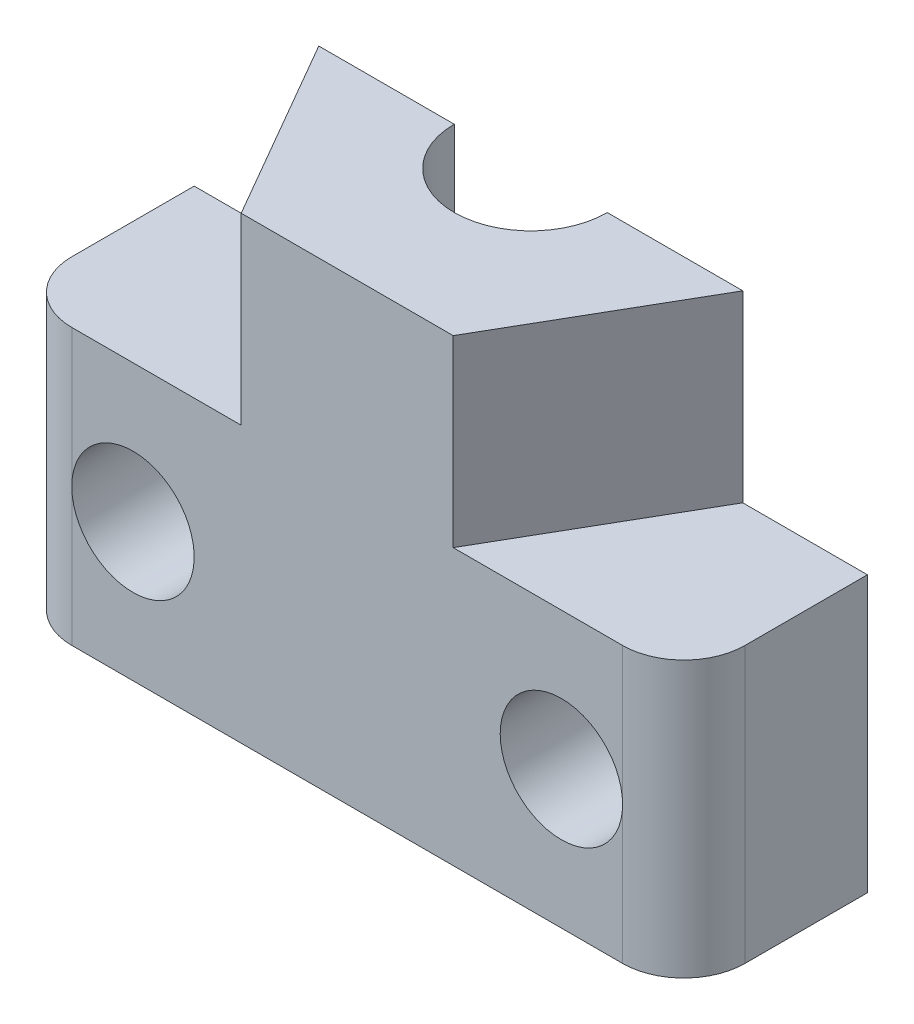
ISO-10303-21;
HEADER;
FILE_DESCRIPTION(('STEP AP214'),'2;1');
FILE_NAME('part.step','',(''),(''),'','','');
FILE_SCHEMA(('AUTOMOTIVE_DESIGN { 1 0 10303 214 1 1 1 1 }'));
ENDSEC;
DATA;
#1=APPLICATION_CONTEXT('core data for automotive mechanical design processes');
#2=APPLICATION_PROTOCOL_DEFINITION('international standard','automotive_design',2000,#1);
#3=PRODUCT_CONTEXT('',#1,'mechanical');
#4=PRODUCT('Part','Part','',(#3));
#5=PRODUCT_RELATED_PRODUCT_CATEGORY('part','',(#4));
#6=PRODUCT_DEFINITION_FORMATION('','',#4);
#7=PRODUCT_DEFINITION_CONTEXT('part definition',#1,'design');
#8=PRODUCT_DEFINITION('design','',#6,#7);
#9=PRODUCT_DEFINITION_SHAPE('','',#8);
#10=(LENGTH_UNIT() NAMED_UNIT(*) SI_UNIT(.MILLI.,.METRE.));
#11=(NAMED_UNIT(*) PLANE_ANGLE_UNIT() SI_UNIT($,.RADIAN.));
#12=(NAMED_UNIT(*) SI_UNIT($,.STERADIAN.) SOLID_ANGLE_UNIT());
#13=UNCERTAINTY_MEASURE_WITH_UNIT(LENGTH_MEASURE(1.E-05),#10,'distance_accuracy_value','');
#14=(GEOMETRIC_REPRESENTATION_CONTEXT(3) GLOBAL_UNCERTAINTY_ASSIGNED_CONTEXT((#13)) GLOBAL_UNIT_ASSIGNED_CONTEXT((#10,
#11,#12)) REPRESENTATION_CONTEXT('',''));
#15=CARTESIAN_POINT('',(0.,0.,0.));
#16=DIRECTION('',(0.,0.,1.));
#17=DIRECTION('',(1.,0.,0.));
#18=AXIS2_PLACEMENT_3D('',#15,#16,#17);
#19=CARTESIAN_POINT('',(0.,15.,0.));
#20=DIRECTION('',(0.,1.,0.));
#21=DIRECTION('',(0.,0.,1.));
#22=AXIS2_PLACEMENT_3D('',#19,#20,#21);
#23=PLANE('',#22);
#24=DIRECTION('',(0.5,0.,-0.866025403784439));
#25=VECTOR('',#24,1.);
#26=CARTESIAN_POINT('',(3.46410161513776,15.,6.00000000000001));
#27=LINE('',#26,#25);
#28=CARTESIAN_POINT('',(3.46410161513776,15.,6.00000000000001));
#29=VERTEX_POINT('',#28);
#30=CARTESIAN_POINT('',(6.92820323027551,15.,0.));
#31=VERTEX_POINT('',#30);
#32=EDGE_CURVE('E228',#29,#31,#27,.T.);
#33=ORIENTED_EDGE('',*,*,#32,.T.);
#34=DIRECTION('',(-1.,0.,0.));
#35=VECTOR('',#34,1.);
#36=CARTESIAN_POINT('',(0.,15.,0.));
#37=LINE('',#36,#35);
#38=CARTESIAN_POINT('',(2.5,15.,0.));
#39=VERTEX_POINT('',#38);
#40=EDGE_CURVE('E334',#31,#39,#37,.T.);
#41=ORIENTED_EDGE('',*,*,#40,.T.);
#42=CARTESIAN_POINT('',(0.,15.,0.));
#43=DIRECTION('',(0.,1.,0.));
#44=DIRECTION('',(0.,0.,1.));
#45=AXIS2_PLACEMENT_3D('',#42,#43,#44);
#46=CIRCLE('',#45,2.5);
#47=CARTESIAN_POINT('',(-2.5,15.,0.));
#48=VERTEX_POINT('',#47);
#49=EDGE_CURVE('E210',#48,#39,#46,.T.);
#50=ORIENTED_EDGE('',*,*,#49,.F.);
#51=CARTESIAN_POINT('',(-6.92820323027552,15.,0.));
#52=VERTEX_POINT('',#51);
#53=EDGE_CURVE('E62',#48,#52,#37,.T.);
#54=ORIENTED_EDGE('',*,*,#53,.T.);
#55=DIRECTION('',(0.5,0.,0.866025403784439));
#56=VECTOR('',#55,1.);
#57=CARTESIAN_POINT('',(-6.92820323027552,15.,0.));
#58=LINE('',#57,#56);
#59=CARTESIAN_POINT('',(-3.46410161513776,15.,6.00000000000001));
#60=VERTEX_POINT('',#59);
#61=EDGE_CURVE('E386',#52,#60,#58,.T.);
#62=ORIENTED_EDGE('',*,*,#61,.T.);
#63=DIRECTION('',(1.,0.,0.));
#64=VECTOR('',#63,1.);
#65=CARTESIAN_POINT('',(-3.46410161513776,15.,6.00000000000001));
#66=LINE('',#65,#64);
#67=EDGE_CURVE('E235',#60,#29,#66,.T.);
#68=ORIENTED_EDGE('',*,*,#67,.T.);
#69=EDGE_LOOP('',(#33,#41,#50,#54,#62,#68));
#70=FACE_BOUND('',#69,.T.);
#71=ADVANCED_FACE('F37',(#70),#23,.T.);
#72=CARTESIAN_POINT('',(0.,12.,0.));
#73=DIRECTION('',(0.,1.,0.));
#74=DIRECTION('',(0.,0.,1.));
#75=AXIS2_PLACEMENT_3D('',#72,#73,#74);
#76=PLANE('',#75);
#77=DIRECTION('',(-1.,0.,0.));
#78=VECTOR('',#77,1.);
#79=CARTESIAN_POINT('',(0.,12.,0.));
#80=LINE('',#79,#78);
#81=CARTESIAN_POINT('',(5.77350269189626,12.,0.));
#82=VERTEX_POINT('',#81);
#83=CARTESIAN_POINT('',(2.5,12.,0.));
#84=VERTEX_POINT('',#83);
#85=EDGE_CURVE('E54',#82,#84,#80,.T.);
#86=ORIENTED_EDGE('',*,*,#85,.F.);
#87=DIRECTION('',(0.5,0.,-0.866025403784439));
#88=VECTOR('',#87,1.);
#89=CARTESIAN_POINT('',(2.88675134594813,12.,5.));
#90=LINE('',#89,#88);
#91=CARTESIAN_POINT('',(2.88675134594813,12.,5.));
#92=VERTEX_POINT('',#91);
#93=EDGE_CURVE('E359',#92,#82,#90,.T.);
#94=ORIENTED_EDGE('',*,*,#93,.F.);
#95=DIRECTION('',(1.,0.,0.));
#96=VECTOR('',#95,1.);
#97=CARTESIAN_POINT('',(-2.88675134594813,12.,5.));
#98=LINE('',#97,#96);
#99=CARTESIAN_POINT('',(-2.88675134594813,12.,5.));
#100=VERTEX_POINT('',#99);
#101=EDGE_CURVE('E364',#100,#92,#98,.T.);
#102=ORIENTED_EDGE('',*,*,#101,.F.);
#103=DIRECTION('',(0.5,0.,0.866025403784438));
#104=VECTOR('',#103,1.);
#105=CARTESIAN_POINT('',(-5.77350269189626,12.,0.));
#106=LINE('',#105,#104);
#107=CARTESIAN_POINT('',(-5.77350269189626,12.,0.));
#108=VERTEX_POINT('',#107);
#109=EDGE_CURVE('E205',#108,#100,#106,.T.);
#110=ORIENTED_EDGE('',*,*,#109,.F.);
#111=CARTESIAN_POINT('',(-2.5,12.,0.));
#112=VERTEX_POINT('',#111);
#113=EDGE_CURVE('E191',#112,#108,#80,.T.);
#114=ORIENTED_EDGE('',*,*,#113,.F.);
#115=CARTESIAN_POINT('',(0.,12.,0.));
#116=DIRECTION('',(0.,1.,0.));
#117=DIRECTION('',(0.,0.,1.));
#118=AXIS2_PLACEMENT_3D('',#115,#116,#117);
#119=CIRCLE('',#118,2.5);
#120=EDGE_CURVE('E203',#84,#112,#119,.F.);
#121=ORIENTED_EDGE('',*,*,#120,.F.);
#122=EDGE_LOOP('',(#86,#94,#102,#110,#114,#121));
#123=FACE_BOUND('',#122,.T.);
#124=ADVANCED_FACE('F202',(#123),#76,.F.);
#125=CARTESIAN_POINT('',(0.,9.,0.));
#126=DIRECTION('',(0.,-1.,0.));
#127=DIRECTION('',(0.,0.,-1.));
#128=AXIS2_PLACEMENT_3D('',#125,#126,#127);
#129=PLANE('',#128);
#130=DIRECTION('',(1.,0.,0.));
#131=VECTOR('',#130,1.);
#132=CARTESIAN_POINT('',(0.,9.,0.));
#133=LINE('',#132,#131);
#134=CARTESIAN_POINT('',(-11.,9.,0.));
#135=VERTEX_POINT('',#134);
#136=CARTESIAN_POINT('',(-6.92820323027552,9.,0.));
#137=VERTEX_POINT('',#136);
#138=EDGE_CURVE('E322',#135,#137,#133,.T.);
#139=ORIENTED_EDGE('',*,*,#138,.F.);
#140=DIRECTION('',(0.,0.,1.));
#141=VECTOR('',#140,1.);
#142=CARTESIAN_POINT('',(-11.,9.,6.));
#143=LINE('',#142,#141);
#144=CARTESIAN_POINT('',(-11.,9.,4.));
#145=VERTEX_POINT('',#144);
#146=EDGE_CURVE('E258',#135,#145,#143,.T.);
#147=ORIENTED_EDGE('',*,*,#146,.T.);
#148=CARTESIAN_POINT('',(-9.,9.,4.));
#149=DIRECTION('',(0.,-1.,0.));
#150=DIRECTION('',(0.,0.,-1.));
#151=AXIS2_PLACEMENT_3D('',#148,#149,#150);
#152=CIRCLE('',#151,2.);
#153=CARTESIAN_POINT('',(-9.,9.,6.));
#154=VERTEX_POINT('',#153);
#155=EDGE_CURVE('E281',#145,#154,#152,.F.);
#156=ORIENTED_EDGE('',*,*,#155,.T.);
#157=DIRECTION('',(1.,0.,0.));
#158=VECTOR('',#157,1.);
#159=CARTESIAN_POINT('',(-11.,9.,6.));
#160=LINE('',#159,#158);
#161=CARTESIAN_POINT('',(-3.46410161513776,9.,6.));
#162=VERTEX_POINT('',#161);
#163=EDGE_CURVE('E269',#154,#162,#160,.T.);
#164=ORIENTED_EDGE('',*,*,#163,.T.);
#165=DIRECTION('',(0.5,0.,0.866025403784439));
#166=VECTOR('',#165,1.);
#167=CARTESIAN_POINT('',(-6.92820323027552,9.,0.));
#168=LINE('',#167,#166);
#169=EDGE_CURVE('E224',#137,#162,#168,.T.);
#170=ORIENTED_EDGE('',*,*,#169,.F.);
#171=EDGE_LOOP('',(#139,#147,#156,#164,#170));
#172=FACE_BOUND('',#171,.T.);
#173=ADVANCED_FACE('F419',(#172),#129,.F.);
#174=DIRECTION('',(1.,0.,0.));
#175=VECTOR('',#174,1.);
#176=CARTESIAN_POINT('',(0.,9.,0.));
#177=LINE('',#176,#175);
#178=CARTESIAN_POINT('',(6.92820323027551,9.,0.));
#179=VERTEX_POINT('',#178);
#180=CARTESIAN_POINT('',(11.,9.,0.));
#181=VERTEX_POINT('',#180);
#182=EDGE_CURVE('E314',#179,#181,#177,.T.);
#183=ORIENTED_EDGE('',*,*,#182,.F.);
#184=DIRECTION('',(0.5,0.,-0.866025403784439));
#185=VECTOR('',#184,1.);
#186=CARTESIAN_POINT('',(3.46410161513776,9.,6.00000000000001));
#187=LINE('',#186,#185);
#188=CARTESIAN_POINT('',(3.46410161513776,9.,6.));
#189=VERTEX_POINT('',#188);
#190=EDGE_CURVE('E229',#189,#179,#187,.T.);
#191=ORIENTED_EDGE('',*,*,#190,.F.);
#192=CARTESIAN_POINT('',(9.,9.,6.));
#193=VERTEX_POINT('',#192);
#194=EDGE_CURVE('E261',#189,#193,#160,.T.);
#195=ORIENTED_EDGE('',*,*,#194,.T.);
#196=CARTESIAN_POINT('',(9.,9.,4.));
#197=DIRECTION('',(0.,-1.,0.));
#198=DIRECTION('',(0.,0.,-1.));
#199=AXIS2_PLACEMENT_3D('',#196,#197,#198);
#200=CIRCLE('',#199,2.);
#201=CARTESIAN_POINT('',(11.,9.,4.));
#202=VERTEX_POINT('',#201);
#203=EDGE_CURVE('E279',#193,#202,#200,.F.);
#204=ORIENTED_EDGE('',*,*,#203,.T.);
#205=DIRECTION('',(0.,0.,-1.));
#206=VECTOR('',#205,1.);
#207=CARTESIAN_POINT('',(11.,9.,6.));
#208=LINE('',#207,#206);
#209=EDGE_CURVE('E255',#202,#181,#208,.T.);
#210=ORIENTED_EDGE('',*,*,#209,.T.);
#211=EDGE_LOOP('',(#183,#191,#195,#204,#210));
#212=FACE_BOUND('',#211,.T.);
#213=ADVANCED_FACE('F400',(#212),#129,.F.);
#214=CARTESIAN_POINT('',(0.,0.,0.));
#215=DIRECTION('',(0.,-1.,0.));
#216=DIRECTION('',(0.,0.,-1.));
#217=AXIS2_PLACEMENT_3D('',#214,#215,#216);
#218=PLANE('',#217);
#219=DIRECTION('',(0.,0.,1.));
#220=VECTOR('',#219,1.);
#221=CARTESIAN_POINT('',(-11.,0.,6.));
#222=LINE('',#221,#220);
#223=CARTESIAN_POINT('',(-11.,0.,0.));
#224=VERTEX_POINT('',#223);
#225=CARTESIAN_POINT('',(-11.,0.,4.));
#226=VERTEX_POINT('',#225);
#227=EDGE_CURVE('E291',#224,#226,#222,.T.);
#228=ORIENTED_EDGE('',*,*,#227,.F.);
#229=DIRECTION('',(1.,0.,0.));
#230=VECTOR('',#229,1.);
#231=CARTESIAN_POINT('',(0.,0.,0.));
#232=LINE('',#231,#230);
#233=CARTESIAN_POINT('',(-4.,0.,0.));
#234=VERTEX_POINT('',#233);
#235=EDGE_CURVE('E313',#224,#234,#232,.T.);
#236=ORIENTED_EDGE('',*,*,#235,.T.);
#237=CARTESIAN_POINT('',(0.,0.,0.));
#238=DIRECTION('',(0.,1.,0.));
#239=DIRECTION('',(0.,0.,1.));
#240=AXIS2_PLACEMENT_3D('',#237,#238,#239);
#241=CIRCLE('',#240,4.);
#242=CARTESIAN_POINT('',(4.,0.,0.));
#243=VERTEX_POINT('',#242);
#244=EDGE_CURVE('E251',#234,#243,#241,.T.);
#245=ORIENTED_EDGE('',*,*,#244,.T.);
#246=CARTESIAN_POINT('',(11.,0.,0.));
#247=VERTEX_POINT('',#246);
#248=EDGE_CURVE('E307',#243,#247,#232,.T.);
#249=ORIENTED_EDGE('',*,*,#248,.T.);
#250=DIRECTION('',(0.,0.,-1.));
#251=VECTOR('',#250,1.);
#252=CARTESIAN_POINT('',(11.,0.,6.));
#253=LINE('',#252,#251);
#254=CARTESIAN_POINT('',(11.,0.,4.));
#255=VERTEX_POINT('',#254);
#256=EDGE_CURVE('E254',#255,#247,#253,.T.);
#257=ORIENTED_EDGE('',*,*,#256,.F.);
#258=CARTESIAN_POINT('',(9.,0.,4.));
#259=DIRECTION('',(0.,-1.,0.));
#260=DIRECTION('',(0.,0.,-1.));
#261=AXIS2_PLACEMENT_3D('',#258,#259,#260);
#262=CIRCLE('',#261,2.);
#263=CARTESIAN_POINT('',(9.,0.,6.));
#264=VERTEX_POINT('',#263);
#265=EDGE_CURVE('E283',#255,#264,#262,.T.);
#266=ORIENTED_EDGE('',*,*,#265,.T.);
#267=DIRECTION('',(1.,0.,0.));
#268=VECTOR('',#267,1.);
#269=CARTESIAN_POINT('',(-11.,0.,6.));
#270=LINE('',#269,#268);
#271=CARTESIAN_POINT('',(-9.,0.,6.));
#272=VERTEX_POINT('',#271);
#273=EDGE_CURVE('E259',#272,#264,#270,.T.);
#274=ORIENTED_EDGE('',*,*,#273,.F.);
#275=CARTESIAN_POINT('',(-9.,0.,4.));
#276=DIRECTION('',(0.,-1.,0.));
#277=DIRECTION('',(0.,0.,-1.));
#278=AXIS2_PLACEMENT_3D('',#275,#276,#277);
#279=CIRCLE('',#278,2.);
#280=EDGE_CURVE('E285',#272,#226,#279,.T.);
#281=ORIENTED_EDGE('',*,*,#280,.T.);
#282=EDGE_LOOP('',(#228,#236,#245,#249,#257,#266,#274,#281));
#283=FACE_BOUND('',#282,.T.);
#284=ADVANCED_FACE('F305',(#283),#218,.T.);
#285=CARTESIAN_POINT('',(11.,9.,6.));
#286=DIRECTION('',(-1.,0.,0.));
#287=DIRECTION('',(0.,0.,1.));
#288=AXIS2_PLACEMENT_3D('',#285,#286,#287);
#289=PLANE('',#288);
#290=DIRECTION('',(0.,-1.,0.));
#291=VECTOR('',#290,1.);
#292=CARTESIAN_POINT('',(11.,9.,0.));
#293=LINE('',#292,#291);
#294=EDGE_CURVE('E301',#181,#247,#293,.T.);
#295=ORIENTED_EDGE('',*,*,#294,.F.);
#296=ORIENTED_EDGE('',*,*,#209,.F.);
#297=DIRECTION('',(0.,-1.,0.));
#298=VECTOR('',#297,1.);
#299=CARTESIAN_POINT('',(11.,9.,4.));
#300=LINE('',#299,#298);
#301=EDGE_CURVE('E276',#202,#255,#300,.T.);
#302=ORIENTED_EDGE('',*,*,#301,.T.);
#303=ORIENTED_EDGE('',*,*,#256,.T.);
#304=EDGE_LOOP('',(#295,#296,#302,#303));
#305=FACE_BOUND('',#304,.T.);
#306=ADVANCED_FACE('F299',(#305),#289,.F.);
#307=CARTESIAN_POINT('',(-11.,9.,6.));
#308=DIRECTION('',(1.,0.,0.));
#309=DIRECTION('',(0.,0.,-1.));
#310=AXIS2_PLACEMENT_3D('',#307,#308,#309);
#311=PLANE('',#310);
#312=DIRECTION('',(0.,1.,0.));
#313=VECTOR('',#312,1.);
#314=CARTESIAN_POINT('',(-11.,9.,0.));
#315=LINE('',#314,#313);
#316=EDGE_CURVE('E320',#224,#135,#315,.T.);
#317=ORIENTED_EDGE('',*,*,#316,.F.);
#318=ORIENTED_EDGE('',*,*,#227,.T.);
#319=DIRECTION('',(0.,-1.,0.));
#320=VECTOR('',#319,1.);
#321=CARTESIAN_POINT('',(-11.,9.,4.));
#322=LINE('',#321,#320);
#323=EDGE_CURVE('E270',#226,#145,#322,.F.);
#324=ORIENTED_EDGE('',*,*,#323,.T.);
#325=ORIENTED_EDGE('',*,*,#146,.F.);
#326=EDGE_LOOP('',(#317,#318,#324,#325));
#327=FACE_BOUND('',#326,.T.);
#328=ADVANCED_FACE('F416',(#327),#311,.F.);
#329=CARTESIAN_POINT('',(0.,8.,0.));
#330=DIRECTION('',(0.,-1.,0.));
#331=DIRECTION('',(0.,0.,-1.));
#332=AXIS2_PLACEMENT_3D('',#329,#330,#331);
#333=CYLINDRICAL_SURFACE('',#332,4.);
#334=CARTESIAN_POINT('',(0.,8.,0.));
#335=DIRECTION('',(0.,-1.,0.));
#336=DIRECTION('',(0.,0.,-1.));
#337=AXIS2_PLACEMENT_3D('',#334,#335,#336);
#338=CIRCLE('',#337,4.);
#339=CARTESIAN_POINT('',(4.,8.,0.));
#340=VERTEX_POINT('',#339);
#341=CARTESIAN_POINT('',(-4.,8.,0.));
#342=VERTEX_POINT('',#341);
#343=EDGE_CURVE('E244',#340,#342,#338,.T.);
#344=ORIENTED_EDGE('',*,*,#343,.F.);
#345=DIRECTION('',(0.,-1.,0.));
#346=VECTOR('',#345,1.);
#347=CARTESIAN_POINT('',(4.,8.,0.));
#348=LINE('',#347,#346);
#349=EDGE_CURVE('E311',#340,#243,#348,.T.);
#350=ORIENTED_EDGE('',*,*,#349,.T.);
#351=ORIENTED_EDGE('',*,*,#244,.F.);
#352=DIRECTION('',(0.,-1.,0.));
#353=VECTOR('',#352,1.);
#354=CARTESIAN_POINT('',(-4.,8.,0.));
#355=LINE('',#354,#353);
#356=EDGE_CURVE('E321',#234,#342,#355,.F.);
#357=ORIENTED_EDGE('',*,*,#356,.T.);
#358=EDGE_LOOP('',(#344,#350,#351,#357));
#359=FACE_BOUND('',#358,.T.);
#360=ADVANCED_FACE('F491',(#359),#333,.F.);
#361=CARTESIAN_POINT('',(0.,9.,0.));
#362=DIRECTION('',(0.,-1.,0.));
#363=DIRECTION('',(0.,0.,-1.));
#364=AXIS2_PLACEMENT_3D('',#361,#362,#363);
#365=CYLINDRICAL_SURFACE('',#364,5.);
#366=DIRECTION('',(0.,-1.,0.));
#367=VECTOR('',#366,1.);
#368=CARTESIAN_POINT('',(5.,9.,0.));
#369=LINE('',#368,#367);
#370=CARTESIAN_POINT('',(5.,8.,0.));
#371=VERTEX_POINT('',#370);
#372=CARTESIAN_POINT('',(5.,9.,0.));
#373=VERTEX_POINT('',#372);
#374=EDGE_CURVE('E425',#371,#373,#369,.F.);
#375=ORIENTED_EDGE('',*,*,#374,.F.);
#376=CARTESIAN_POINT('',(0.,8.,0.));
#377=DIRECTION('',(0.,-1.,0.));
#378=DIRECTION('',(0.,0.,-1.));
#379=AXIS2_PLACEMENT_3D('',#376,#377,#378);
#380=CIRCLE('',#379,5.);
#381=CARTESIAN_POINT('',(-5.,8.,0.));
#382=VERTEX_POINT('',#381);
#383=EDGE_CURVE('E241',#371,#382,#380,.T.);
#384=ORIENTED_EDGE('',*,*,#383,.T.);
#385=DIRECTION('',(0.,-1.,0.));
#386=VECTOR('',#385,1.);
#387=CARTESIAN_POINT('',(-5.,9.,0.));
#388=LINE('',#387,#386);
#389=CARTESIAN_POINT('',(-5.,9.,0.));
#390=VERTEX_POINT('',#389);
#391=EDGE_CURVE('E327',#390,#382,#388,.T.);
#392=ORIENTED_EDGE('',*,*,#391,.F.);
#393=CARTESIAN_POINT('',(0.,9.,0.));
#394=DIRECTION('',(0.,-1.,0.));
#395=DIRECTION('',(0.,0.,-1.));
#396=AXIS2_PLACEMENT_3D('',#393,#394,#395);
#397=CIRCLE('',#396,5.);
#398=CARTESIAN_POINT('',(-4.3301270189222,9.,2.5));
#399=VERTEX_POINT('',#398);
#400=EDGE_CURVE('E246',#399,#390,#397,.T.);
#401=ORIENTED_EDGE('',*,*,#400,.F.);
#402=CARTESIAN_POINT('',(0.,9.,5.));
#403=VERTEX_POINT('',#402);
#404=EDGE_CURVE('E445',#403,#399,#397,.T.);
#405=ORIENTED_EDGE('',*,*,#404,.F.);
#406=CARTESIAN_POINT('',(4.3301270189222,9.,2.5));
#407=VERTEX_POINT('',#406);
#408=EDGE_CURVE('E245',#407,#403,#397,.T.);
#409=ORIENTED_EDGE('',*,*,#408,.F.);
#410=EDGE_CURVE('E242',#373,#407,#397,.T.);
#411=ORIENTED_EDGE('',*,*,#410,.F.);
#412=EDGE_LOOP('',(#375,#384,#392,#401,#405,#409,#411));
#413=FACE_BOUND('',#412,.T.);
#414=ADVANCED_FACE('F434',(#413),#365,.F.);
#415=CARTESIAN_POINT('',(0.,8.,0.));
#416=DIRECTION('',(0.,-1.,0.));
#417=DIRECTION('',(0.,0.,-1.));
#418=AXIS2_PLACEMENT_3D('',#415,#416,#417);
#419=PLANE('',#418);
#420=DIRECTION('',(1.,0.,0.));
#421=VECTOR('',#420,1.);
#422=CARTESIAN_POINT('',(0.,8.,0.));
#423=LINE('',#422,#421);
#424=EDGE_CURVE('E324',#382,#342,#423,.T.);
#425=ORIENTED_EDGE('',*,*,#424,.F.);
#426=ORIENTED_EDGE('',*,*,#383,.F.);
#427=EDGE_CURVE('E316',#340,#371,#423,.T.);
#428=ORIENTED_EDGE('',*,*,#427,.F.);
#429=ORIENTED_EDGE('',*,*,#343,.T.);
#430=EDGE_LOOP('',(#425,#426,#428,#429));
#431=FACE_BOUND('',#430,.T.);
#432=ADVANCED_FACE('F438',(#431),#419,.F.);
#433=CARTESIAN_POINT('',(0.,9.,0.));
#434=DIRECTION('',(0.,1.,0.));
#435=DIRECTION('',(0.,0.,1.));
#436=AXIS2_PLACEMENT_3D('',#433,#434,#435);
#437=PLANE('',#436);
#438=DIRECTION('',(0.5,0.,-0.866025403784439));
#439=VECTOR('',#438,1.);
#440=CARTESIAN_POINT('',(2.88675134594813,9.,5.));
#441=LINE('',#440,#439);
#442=CARTESIAN_POINT('',(5.77350269189626,9.,0.));
#443=VERTEX_POINT('',#442);
#444=EDGE_CURVE('E209',#407,#443,#441,.T.);
#445=ORIENTED_EDGE('',*,*,#444,.T.);
#446=DIRECTION('',(-1.,0.,0.));
#447=VECTOR('',#446,1.);
#448=CARTESIAN_POINT('',(0.,9.,0.));
#449=LINE('',#448,#447);
#450=EDGE_CURVE('E422',#443,#373,#449,.T.);
#451=ORIENTED_EDGE('',*,*,#450,.T.);
#452=ORIENTED_EDGE('',*,*,#410,.T.);
#453=EDGE_LOOP('',(#445,#451,#452));
#454=FACE_BOUND('',#453,.T.);
#455=ADVANCED_FACE('F464',(#454),#437,.T.);
#456=ORIENTED_EDGE('',*,*,#400,.T.);
#457=DIRECTION('',(-1.,0.,0.));
#458=VECTOR('',#457,1.);
#459=CARTESIAN_POINT('',(0.,9.,0.));
#460=LINE('',#459,#458);
#461=CARTESIAN_POINT('',(-5.77350269189626,9.,0.));
#462=VERTEX_POINT('',#461);
#463=EDGE_CURVE('E331',#390,#462,#460,.T.);
#464=ORIENTED_EDGE('',*,*,#463,.T.);
#465=DIRECTION('',(0.5,0.,0.866025403784438));
#466=VECTOR('',#465,1.);
#467=CARTESIAN_POINT('',(-5.77350269189626,9.,0.));
#468=LINE('',#467,#466);
#469=EDGE_CURVE('E369',#462,#399,#468,.T.);
#470=ORIENTED_EDGE('',*,*,#469,.T.);
#471=EDGE_LOOP('',(#456,#464,#470));
#472=FACE_BOUND('',#471,.T.);
#473=ADVANCED_FACE('F443',(#472),#437,.T.);
#474=CARTESIAN_POINT('',(0.,22.0710678118655,0.));
#475=DIRECTION('',(0.,-1.,0.));
#476=DIRECTION('',(0.,0.,-1.));
#477=AXIS2_PLACEMENT_3D('',#474,#475,#476);
#478=CYLINDRICAL_SURFACE('',#477,2.5);
#479=ORIENTED_EDGE('',*,*,#49,.T.);
#480=DIRECTION('',(0.,-1.,0.));
#481=VECTOR('',#480,1.);
#482=CARTESIAN_POINT('',(2.5,22.0710678118655,0.));
#483=LINE('',#482,#481);
#484=EDGE_CURVE('E208',#39,#84,#483,.T.);
#485=ORIENTED_EDGE('',*,*,#484,.T.);
#486=ORIENTED_EDGE('',*,*,#120,.T.);
#487=DIRECTION('',(0.,-1.,0.));
#488=VECTOR('',#487,1.);
#489=CARTESIAN_POINT('',(-2.5,22.0710678118655,0.));
#490=LINE('',#489,#488);
#491=EDGE_CURVE('E188',#112,#48,#490,.F.);
#492=ORIENTED_EDGE('',*,*,#491,.T.);
#493=EDGE_LOOP('',(#479,#485,#486,#492));
#494=FACE_BOUND('',#493,.T.);
#495=ADVANCED_FACE('F207',(#494),#478,.F.);
#496=CARTESIAN_POINT('',(-7.,4.5,6.00005));
#497=DIRECTION('',(0.,0.,-1.));
#498=DIRECTION('',(-1.,0.,0.));
#499=AXIS2_PLACEMENT_3D('',#496,#497,#498);
#500=CYLINDRICAL_SURFACE('',#499,2.);
#501=CARTESIAN_POINT('',(-7.,4.5,6.));
#502=DIRECTION('',(0.,0.,-1.));
#503=DIRECTION('',(-1.,0.,0.));
#504=AXIS2_PLACEMENT_3D('',#501,#502,#503);
#505=CIRCLE('',#504,2.);
#506=CARTESIAN_POINT('',(-9.,4.5,6.));
#507=VERTEX_POINT('',#506);
#508=EDGE_CURVE('E214',#507,#507,#505,.T.);
#509=ORIENTED_EDGE('',*,*,#508,.F.);
#510=EDGE_LOOP('',(#509));
#511=FACE_BOUND('',#510,.T.);
#512=CARTESIAN_POINT('',(-7.,4.5,0.));
#513=DIRECTION('',(0.,0.,-1.));
#514=DIRECTION('',(-1.,0.,0.));
#515=AXIS2_PLACEMENT_3D('',#512,#513,#514);
#516=CIRCLE('',#515,2.);
#517=CARTESIAN_POINT('',(-9.,4.5,0.));
#518=VERTEX_POINT('',#517);
#519=EDGE_CURVE('E197',#518,#518,#516,.F.);
#520=ORIENTED_EDGE('',*,*,#519,.F.);
#521=EDGE_LOOP('',(#520));
#522=FACE_BOUND('',#521,.T.);
#523=ADVANCED_FACE('F623',(#511,#522),#500,.F.);
#524=CARTESIAN_POINT('',(7.,4.5,6.00005));
#525=DIRECTION('',(0.,0.,-1.));
#526=DIRECTION('',(-1.,0.,0.));
#527=AXIS2_PLACEMENT_3D('',#524,#525,#526);
#528=CYLINDRICAL_SURFACE('',#527,2.);
#529=CARTESIAN_POINT('',(7.,4.5,6.));
#530=DIRECTION('',(0.,0.,-1.));
#531=DIRECTION('',(-1.,0.,0.));
#532=AXIS2_PLACEMENT_3D('',#529,#530,#531);
#533=CIRCLE('',#532,2.);
#534=CARTESIAN_POINT('',(9.,4.5,6.));
#535=VERTEX_POINT('',#534);
#536=EDGE_CURVE('E353',#535,#535,#533,.F.);
#537=ORIENTED_EDGE('',*,*,#536,.T.);
#538=EDGE_LOOP('',(#537));
#539=FACE_BOUND('',#538,.T.);
#540=CARTESIAN_POINT('',(7.,4.5,0.));
#541=DIRECTION('',(0.,0.,-1.));
#542=DIRECTION('',(-1.,0.,0.));
#543=AXIS2_PLACEMENT_3D('',#540,#541,#542);
#544=CIRCLE('',#543,2.);
#545=CARTESIAN_POINT('',(5.,4.5,0.));
#546=VERTEX_POINT('',#545);
#547=EDGE_CURVE('E41',#546,#546,#544,.T.);
#548=ORIENTED_EDGE('',*,*,#547,.T.);
#549=EDGE_LOOP('',(#548));
#550=FACE_BOUND('',#549,.T.);
#551=ADVANCED_FACE('F343',(#539,#550),#528,.F.);
#552=CARTESIAN_POINT('',(-11.,9.,6.));
#553=DIRECTION('',(0.,0.,-1.));
#554=DIRECTION('',(-1.,0.,0.));
#555=AXIS2_PLACEMENT_3D('',#552,#553,#554);
#556=PLANE('',#555);
#557=DIRECTION('',(0.,-1.,0.));
#558=VECTOR('',#557,1.);
#559=CARTESIAN_POINT('',(9.,9.,6.));
#560=LINE('',#559,#558);
#561=EDGE_CURVE('E11',#264,#535,#560,.F.);
#562=ORIENTED_EDGE('',*,*,#561,.T.);
#563=ORIENTED_EDGE('',*,*,#536,.F.);
#564=EDGE_CURVE('E46',#535,#193,#560,.F.);
#565=ORIENTED_EDGE('',*,*,#564,.T.);
#566=ORIENTED_EDGE('',*,*,#194,.F.);
#567=DIRECTION('',(0.,-1.,0.));
#568=VECTOR('',#567,1.);
#569=CARTESIAN_POINT('',(3.46410161513776,15.,6.00000000000001));
#570=LINE('',#569,#568);
#571=EDGE_CURVE('E223',#29,#189,#570,.T.);
#572=ORIENTED_EDGE('',*,*,#571,.F.);
#573=ORIENTED_EDGE('',*,*,#67,.F.);
#574=DIRECTION('',(0.,-1.,0.));
#575=VECTOR('',#574,1.);
#576=CARTESIAN_POINT('',(-3.46410161513776,15.,6.00000000000001));
#577=LINE('',#576,#575);
#578=EDGE_CURVE('E219',#60,#162,#577,.T.);
#579=ORIENTED_EDGE('',*,*,#578,.T.);
#580=ORIENTED_EDGE('',*,*,#163,.F.);
#581=DIRECTION('',(0.,-1.,0.));
#582=VECTOR('',#581,1.);
#583=CARTESIAN_POINT('',(-9.,9.,6.));
#584=LINE('',#583,#582);
#585=EDGE_CURVE('E272',#154,#507,#584,.T.);
#586=ORIENTED_EDGE('',*,*,#585,.T.);
#587=ORIENTED_EDGE('',*,*,#508,.T.);
#588=EDGE_CURVE('E275',#507,#272,#584,.T.);
#589=ORIENTED_EDGE('',*,*,#588,.T.);
#590=ORIENTED_EDGE('',*,*,#273,.T.);
#591=EDGE_LOOP('',(#562,#563,#565,#566,#572,#573,#579,#580,#586,#587,#589,#590));
#592=FACE_BOUND('',#591,.T.);
#593=ADVANCED_FACE('F403',(#592),#556,.F.);
#594=CARTESIAN_POINT('',(9.,9.,4.));
#595=DIRECTION('',(0.,-1.,0.));
#596=DIRECTION('',(0.,0.,-1.));
#597=AXIS2_PLACEMENT_3D('',#594,#595,#596);
#598=CYLINDRICAL_SURFACE('',#597,2.);
#599=ORIENTED_EDGE('',*,*,#203,.F.);
#600=ORIENTED_EDGE('',*,*,#564,.F.);
#601=ORIENTED_EDGE('',*,*,#561,.F.);
#602=ORIENTED_EDGE('',*,*,#265,.F.);
#603=ORIENTED_EDGE('',*,*,#301,.F.);
#604=EDGE_LOOP('',(#599,#600,#601,#602,#603));
#605=FACE_BOUND('',#604,.T.);
#606=ADVANCED_FACE('F408',(#605),#598,.T.);
#607=CARTESIAN_POINT('',(-9.,9.,4.));
#608=DIRECTION('',(0.,-1.,0.));
#609=DIRECTION('',(0.,0.,-1.));
#610=AXIS2_PLACEMENT_3D('',#607,#608,#609);
#611=CYLINDRICAL_SURFACE('',#610,2.);
#612=ORIENTED_EDGE('',*,*,#155,.F.);
#613=ORIENTED_EDGE('',*,*,#323,.F.);
#614=ORIENTED_EDGE('',*,*,#280,.F.);
#615=ORIENTED_EDGE('',*,*,#588,.F.);
#616=ORIENTED_EDGE('',*,*,#585,.F.);
#617=EDGE_LOOP('',(#612,#613,#614,#615,#616));
#618=FACE_BOUND('',#617,.T.);
#619=ADVANCED_FACE('F39',(#618),#611,.T.);
#620=CARTESIAN_POINT('',(-6.92820323027552,15.,0.));
#621=DIRECTION('',(0.866025403784439,0.,-0.5));
#622=DIRECTION('',(-0.5,0.,-0.866025403784439));
#623=AXIS2_PLACEMENT_3D('',#620,#621,#622);
#624=PLANE('',#623);
#625=ORIENTED_EDGE('',*,*,#169,.T.);
#626=ORIENTED_EDGE('',*,*,#578,.F.);
#627=ORIENTED_EDGE('',*,*,#61,.F.);
#628=DIRECTION('',(0.,-1.,0.));
#629=VECTOR('',#628,1.);
#630=CARTESIAN_POINT('',(-6.92820323027552,15.,0.));
#631=LINE('',#630,#629);
#632=EDGE_CURVE('E222',#52,#137,#631,.T.);
#633=ORIENTED_EDGE('',*,*,#632,.T.);
#634=EDGE_LOOP('',(#625,#626,#627,#633));
#635=FACE_BOUND('',#634,.T.);
#636=ADVANCED_FACE('F483',(#635),#624,.F.);
#637=CARTESIAN_POINT('',(3.46410161513776,15.,6.00000000000001));
#638=DIRECTION('',(-0.866025403784439,0.,-0.5));
#639=DIRECTION('',(-0.5,0.,0.866025403784439));
#640=AXIS2_PLACEMENT_3D('',#637,#638,#639);
#641=PLANE('',#640);
#642=ORIENTED_EDGE('',*,*,#190,.T.);
#643=DIRECTION('',(0.,-1.,0.));
#644=VECTOR('',#643,1.);
#645=CARTESIAN_POINT('',(6.92820323027551,15.,0.));
#646=LINE('',#645,#644);
#647=EDGE_CURVE('E239',#31,#179,#646,.T.);
#648=ORIENTED_EDGE('',*,*,#647,.F.);
#649=ORIENTED_EDGE('',*,*,#32,.F.);
#650=ORIENTED_EDGE('',*,*,#571,.T.);
#651=EDGE_LOOP('',(#642,#648,#649,#650));
#652=FACE_BOUND('',#651,.T.);
#653=ADVANCED_FACE('F397',(#652),#641,.F.);
#654=ORIENTED_EDGE('',*,*,#408,.T.);
#655=DIRECTION('',(1.,0.,0.));
#656=VECTOR('',#655,1.);
#657=CARTESIAN_POINT('',(-2.88675134594813,9.,5.));
#658=LINE('',#657,#656);
#659=CARTESIAN_POINT('',(2.88675134594813,9.,5.));
#660=VERTEX_POINT('',#659);
#661=EDGE_CURVE('E372',#403,#660,#658,.T.);
#662=ORIENTED_EDGE('',*,*,#661,.T.);
#663=EDGE_CURVE('E212',#660,#407,#441,.T.);
#664=ORIENTED_EDGE('',*,*,#663,.T.);
#665=EDGE_LOOP('',(#654,#662,#664));
#666=FACE_BOUND('',#665,.T.);
#667=ADVANCED_FACE('F450',(#666),#437,.T.);
#668=ORIENTED_EDGE('',*,*,#404,.T.);
#669=CARTESIAN_POINT('',(-2.88675134594813,9.,5.));
#670=VERTEX_POINT('',#669);
#671=EDGE_CURVE('E368',#399,#670,#468,.T.);
#672=ORIENTED_EDGE('',*,*,#671,.T.);
#673=EDGE_CURVE('E362',#670,#403,#658,.T.);
#674=ORIENTED_EDGE('',*,*,#673,.T.);
#675=EDGE_LOOP('',(#668,#672,#674));
#676=FACE_BOUND('',#675,.T.);
#677=ADVANCED_FACE('F456',(#676),#437,.T.);
#678=CARTESIAN_POINT('',(2.88675134594813,12.,5.));
#679=DIRECTION('',(-0.866025403784439,0.,-0.5));
#680=DIRECTION('',(-0.5,0.,0.866025403784439));
#681=AXIS2_PLACEMENT_3D('',#678,#679,#680);
#682=PLANE('',#681);
#683=ORIENTED_EDGE('',*,*,#663,.F.);
#684=DIRECTION('',(0.,-1.,0.));
#685=VECTOR('',#684,1.);
#686=CARTESIAN_POINT('',(2.88675134594813,12.,5.));
#687=LINE('',#686,#685);
#688=EDGE_CURVE('E365',#92,#660,#687,.T.);
#689=ORIENTED_EDGE('',*,*,#688,.F.);
#690=ORIENTED_EDGE('',*,*,#93,.T.);
#691=DIRECTION('',(0.,-1.,0.));
#692=VECTOR('',#691,1.);
#693=CARTESIAN_POINT('',(5.77350269189626,12.,0.));
#694=LINE('',#693,#692);
#695=EDGE_CURVE('E382',#82,#443,#694,.T.);
#696=ORIENTED_EDGE('',*,*,#695,.T.);
#697=ORIENTED_EDGE('',*,*,#444,.F.);
#698=EDGE_LOOP('',(#683,#689,#690,#696,#697));
#699=FACE_BOUND('',#698,.T.);
#700=ADVANCED_FACE('F461',(#699),#682,.T.);
#701=CARTESIAN_POINT('',(-5.77350269189626,12.,0.));
#702=DIRECTION('',(0.866025403784439,0.,-0.5));
#703=DIRECTION('',(-0.5,0.,-0.866025403784439));
#704=AXIS2_PLACEMENT_3D('',#701,#702,#703);
#705=PLANE('',#704);
#706=ORIENTED_EDGE('',*,*,#469,.F.);
#707=DIRECTION('',(0.,-1.,0.));
#708=VECTOR('',#707,1.);
#709=CARTESIAN_POINT('',(-5.77350269189626,12.,0.));
#710=LINE('',#709,#708);
#711=EDGE_CURVE('E380',#108,#462,#710,.T.);
#712=ORIENTED_EDGE('',*,*,#711,.F.);
#713=ORIENTED_EDGE('',*,*,#109,.T.);
#714=DIRECTION('',(0.,-1.,0.));
#715=VECTOR('',#714,1.);
#716=CARTESIAN_POINT('',(-2.88675134594813,12.,5.));
#717=LINE('',#716,#715);
#718=EDGE_CURVE('E377',#100,#670,#717,.T.);
#719=ORIENTED_EDGE('',*,*,#718,.T.);
#720=ORIENTED_EDGE('',*,*,#671,.F.);
#721=EDGE_LOOP('',(#706,#712,#713,#719,#720));
#722=FACE_BOUND('',#721,.T.);
#723=ADVANCED_FACE('F458',(#722),#705,.T.);
#724=CARTESIAN_POINT('',(-2.88675134594813,12.,5.));
#725=DIRECTION('',(0.,0.,-1.));
#726=DIRECTION('',(-1.,0.,0.));
#727=AXIS2_PLACEMENT_3D('',#724,#725,#726);
#728=PLANE('',#727);
#729=ORIENTED_EDGE('',*,*,#673,.F.);
#730=ORIENTED_EDGE('',*,*,#718,.F.);
#731=ORIENTED_EDGE('',*,*,#101,.T.);
#732=ORIENTED_EDGE('',*,*,#688,.T.);
#733=ORIENTED_EDGE('',*,*,#661,.F.);
#734=EDGE_LOOP('',(#729,#730,#731,#732,#733));
#735=FACE_BOUND('',#734,.T.);
#736=ADVANCED_FACE('F347',(#735),#728,.T.);
#737=CARTESIAN_POINT('',(0.,0.,0.));
#738=DIRECTION('',(0.,0.,-1.));
#739=DIRECTION('',(-1.,0.,0.));
#740=AXIS2_PLACEMENT_3D('',#737,#738,#739);
#741=PLANE('',#740);
#742=ORIENTED_EDGE('',*,*,#547,.F.);
#743=EDGE_LOOP('',(#742));
#744=FACE_BOUND('',#743,.T.);
#745=ORIENTED_EDGE('',*,*,#182,.T.);
#746=ORIENTED_EDGE('',*,*,#294,.T.);
#747=ORIENTED_EDGE('',*,*,#248,.F.);
#748=ORIENTED_EDGE('',*,*,#349,.F.);
#749=ORIENTED_EDGE('',*,*,#427,.T.);
#750=ORIENTED_EDGE('',*,*,#374,.T.);
#751=ORIENTED_EDGE('',*,*,#450,.F.);
#752=ORIENTED_EDGE('',*,*,#695,.F.);
#753=ORIENTED_EDGE('',*,*,#85,.T.);
#754=ORIENTED_EDGE('',*,*,#484,.F.);
#755=ORIENTED_EDGE('',*,*,#40,.F.);
#756=ORIENTED_EDGE('',*,*,#647,.T.);
#757=EDGE_LOOP('',(#745,#746,#747,#748,#749,#750,#751,#752,#753,#754,#755,#756));
#758=FACE_BOUND('',#757,.T.);
#759=ADVANCED_FACE('F345',(#744,#758),#741,.T.);
#760=ORIENTED_EDGE('',*,*,#519,.T.);
#761=EDGE_LOOP('',(#760));
#762=FACE_BOUND('',#761,.T.);
#763=ORIENTED_EDGE('',*,*,#138,.T.);
#764=ORIENTED_EDGE('',*,*,#632,.F.);
#765=ORIENTED_EDGE('',*,*,#53,.F.);
#766=ORIENTED_EDGE('',*,*,#491,.F.);
#767=ORIENTED_EDGE('',*,*,#113,.T.);
#768=ORIENTED_EDGE('',*,*,#711,.T.);
#769=ORIENTED_EDGE('',*,*,#463,.F.);
#770=ORIENTED_EDGE('',*,*,#391,.T.);
#771=ORIENTED_EDGE('',*,*,#424,.T.);
#772=ORIENTED_EDGE('',*,*,#356,.F.);
#773=ORIENTED_EDGE('',*,*,#235,.F.);
#774=ORIENTED_EDGE('',*,*,#316,.T.);
#775=EDGE_LOOP('',(#763,#764,#765,#766,#767,#768,#769,#770,#771,#772,#773,#774));
#776=FACE_BOUND('',#775,.T.);
#777=ADVANCED_FACE('F190',(#762,#776),#741,.T.);
#778=CLOSED_SHELL('',(#71,#124,#173,#213,#284,#306,#328,#360,#414,#432,#455,#473,#495,#523,#551,
#593,#606,#619,#636,#653,#667,#677,#700,#723,#736,#759,#777));
#779=MANIFOLD_SOLID_BREP('B2',#778);
#780=ADVANCED_BREP_SHAPE_REPRESENTATION('',(#18,#779),#14);
#781=SHAPE_DEFINITION_REPRESENTATION(#9,#780);
ENDSEC;
END-ISO-10303-21;
